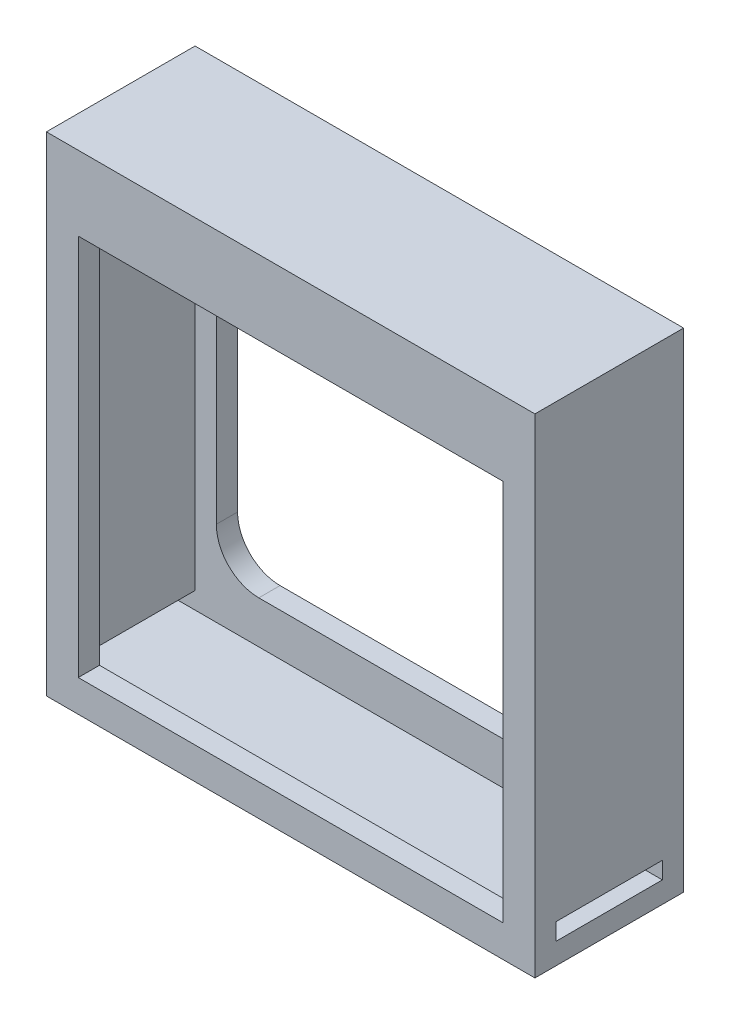
ISO-10303-21;
HEADER;
FILE_DESCRIPTION(('STEP AP214'),'2;1');
FILE_NAME('part.step','',(''),(''),'','','');
FILE_SCHEMA(('AUTOMOTIVE_DESIGN { 1 0 10303 214 1 1 1 1 }'));
ENDSEC;
DATA;
#1=APPLICATION_CONTEXT('core data for automotive mechanical design processes');
#2=APPLICATION_PROTOCOL_DEFINITION('international standard','automotive_design',2000,#1);
#3=PRODUCT_CONTEXT('',#1,'mechanical');
#4=PRODUCT('Part','Part','',(#3));
#5=PRODUCT_RELATED_PRODUCT_CATEGORY('part','',(#4));
#6=PRODUCT_DEFINITION_FORMATION('','',#4);
#7=PRODUCT_DEFINITION_CONTEXT('part definition',#1,'design');
#8=PRODUCT_DEFINITION('design','',#6,#7);
#9=PRODUCT_DEFINITION_SHAPE('','',#8);
#10=(LENGTH_UNIT() NAMED_UNIT(*) SI_UNIT(.MILLI.,.METRE.));
#11=(NAMED_UNIT(*) PLANE_ANGLE_UNIT() SI_UNIT($,.RADIAN.));
#12=(NAMED_UNIT(*) SI_UNIT($,.STERADIAN.) SOLID_ANGLE_UNIT());
#13=UNCERTAINTY_MEASURE_WITH_UNIT(LENGTH_MEASURE(1.E-05),#10,'distance_accuracy_value','');
#14=(GEOMETRIC_REPRESENTATION_CONTEXT(3) GLOBAL_UNCERTAINTY_ASSIGNED_CONTEXT((#13)) GLOBAL_UNIT_ASSIGNED_CONTEXT((#10,
#11,#12)) REPRESENTATION_CONTEXT('',''));
#15=CARTESIAN_POINT('',(0.,0.,0.));
#16=DIRECTION('',(0.,0.,1.));
#17=DIRECTION('',(1.,0.,0.));
#18=AXIS2_PLACEMENT_3D('',#15,#16,#17);
#19=CARTESIAN_POINT('',(57.5,-57.5,35.));
#20=DIRECTION('',(-1.,0.,0.));
#21=DIRECTION('',(0.,0.,1.));
#22=AXIS2_PLACEMENT_3D('',#19,#20,#21);
#23=PLANE('',#22);
#24=DIRECTION('',(0.,0.,1.));
#25=VECTOR('',#24,1.);
#26=CARTESIAN_POINT('',(57.5,-48.5,0.));
#27=LINE('',#26,#25);
#28=CARTESIAN_POINT('',(57.5,-48.5,5.));
#29=VERTEX_POINT('',#28);
#30=CARTESIAN_POINT('',(57.5,-48.5,30.));
#31=VERTEX_POINT('',#30);
#32=EDGE_CURVE('E212',#29,#31,#27,.T.);
#33=ORIENTED_EDGE('',*,*,#32,.F.);
#34=DIRECTION('',(0.,1.,0.));
#35=VECTOR('',#34,1.);
#36=CARTESIAN_POINT('',(57.5,0.,5.));
#37=LINE('',#36,#35);
#38=CARTESIAN_POINT('',(57.5,-52.5,5.));
#39=VERTEX_POINT('',#38);
#40=EDGE_CURVE('E52',#39,#29,#37,.T.);
#41=ORIENTED_EDGE('',*,*,#40,.F.);
#42=DIRECTION('',(0.,0.,-1.));
#43=VECTOR('',#42,1.);
#44=CARTESIAN_POINT('',(57.5,-52.5,0.));
#45=LINE('',#44,#43);
#46=CARTESIAN_POINT('',(57.5,-52.5,30.));
#47=VERTEX_POINT('',#46);
#48=EDGE_CURVE('E219',#47,#39,#45,.T.);
#49=ORIENTED_EDGE('',*,*,#48,.F.);
#50=DIRECTION('',(0.,-1.,0.));
#51=VECTOR('',#50,1.);
#52=CARTESIAN_POINT('',(57.5,0.,30.));
#53=LINE('',#52,#51);
#54=EDGE_CURVE('E202',#31,#47,#53,.T.);
#55=ORIENTED_EDGE('',*,*,#54,.F.);
#56=EDGE_LOOP('',(#33,#41,#49,#55));
#57=FACE_BOUND('',#56,.T.);
#58=DIRECTION('',(0.,1.,0.));
#59=VECTOR('',#58,1.);
#60=CARTESIAN_POINT('',(57.5,-57.5,0.));
#61=LINE('',#60,#59);
#62=CARTESIAN_POINT('',(57.5,-57.5,0.));
#63=VERTEX_POINT('',#62);
#64=CARTESIAN_POINT('',(57.5,57.5,0.));
#65=VERTEX_POINT('',#64);
#66=EDGE_CURVE('E280',#63,#65,#61,.T.);
#67=ORIENTED_EDGE('',*,*,#66,.T.);
#68=DIRECTION('',(0.,0.,-1.));
#69=VECTOR('',#68,1.);
#70=CARTESIAN_POINT('',(57.5,57.5,35.));
#71=LINE('',#70,#69);
#72=CARTESIAN_POINT('',(57.5,57.5,35.));
#73=VERTEX_POINT('',#72);
#74=EDGE_CURVE('E307',#73,#65,#71,.T.);
#75=ORIENTED_EDGE('',*,*,#74,.F.);
#76=DIRECTION('',(0.,1.,0.));
#77=VECTOR('',#76,1.);
#78=CARTESIAN_POINT('',(57.5,-57.5,35.));
#79=LINE('',#78,#77);
#80=CARTESIAN_POINT('',(57.5,-57.5,35.));
#81=VERTEX_POINT('',#80);
#82=EDGE_CURVE('E281',#81,#73,#79,.T.);
#83=ORIENTED_EDGE('',*,*,#82,.F.);
#84=DIRECTION('',(0.,0.,-1.));
#85=VECTOR('',#84,1.);
#86=CARTESIAN_POINT('',(57.5,-57.5,35.));
#87=LINE('',#86,#85);
#88=EDGE_CURVE('E291',#81,#63,#87,.T.);
#89=ORIENTED_EDGE('',*,*,#88,.T.);
#90=EDGE_LOOP('',(#67,#75,#83,#89));
#91=FACE_BOUND('',#90,.T.);
#92=ADVANCED_FACE('F37',(#57,#91),#23,.F.);
#93=CARTESIAN_POINT('',(-57.5,57.5,35.));
#94=DIRECTION('',(0.,-1.,0.));
#95=DIRECTION('',(0.,0.,-1.));
#96=AXIS2_PLACEMENT_3D('',#93,#94,#95);
#97=PLANE('',#96);
#98=DIRECTION('',(-1.,0.,0.));
#99=VECTOR('',#98,1.);
#100=CARTESIAN_POINT('',(-57.5,57.5,0.));
#101=LINE('',#100,#99);
#102=CARTESIAN_POINT('',(-57.5,57.5,0.));
#103=VERTEX_POINT('',#102);
#104=EDGE_CURVE('E294',#65,#103,#101,.T.);
#105=ORIENTED_EDGE('',*,*,#104,.T.);
#106=DIRECTION('',(0.,0.,-1.));
#107=VECTOR('',#106,1.);
#108=CARTESIAN_POINT('',(-57.5,57.5,35.));
#109=LINE('',#108,#107);
#110=CARTESIAN_POINT('',(-57.5,57.5,35.));
#111=VERTEX_POINT('',#110);
#112=EDGE_CURVE('E304',#111,#103,#109,.T.);
#113=ORIENTED_EDGE('',*,*,#112,.F.);
#114=DIRECTION('',(-1.,0.,0.));
#115=VECTOR('',#114,1.);
#116=CARTESIAN_POINT('',(-57.5,57.5,35.));
#117=LINE('',#116,#115);
#118=EDGE_CURVE('E284',#73,#111,#117,.T.);
#119=ORIENTED_EDGE('',*,*,#118,.F.);
#120=ORIENTED_EDGE('',*,*,#74,.T.);
#121=EDGE_LOOP('',(#105,#113,#119,#120));
#122=FACE_BOUND('',#121,.T.);
#123=ADVANCED_FACE('F424',(#122),#97,.F.);
#124=CARTESIAN_POINT('',(-57.5,-57.5,35.));
#125=DIRECTION('',(1.,0.,0.));
#126=DIRECTION('',(0.,0.,-1.));
#127=AXIS2_PLACEMENT_3D('',#124,#125,#126);
#128=PLANE('',#127);
#129=DIRECTION('',(0.,0.,-1.));
#130=VECTOR('',#129,1.);
#131=CARTESIAN_POINT('',(-57.5,-52.5,0.));
#132=LINE('',#131,#130);
#133=CARTESIAN_POINT('',(-57.5,-52.5,30.));
#134=VERTEX_POINT('',#133);
#135=CARTESIAN_POINT('',(-57.5,-52.5,5.));
#136=VERTEX_POINT('',#135);
#137=EDGE_CURVE('E231',#134,#136,#132,.T.);
#138=ORIENTED_EDGE('',*,*,#137,.T.);
#139=DIRECTION('',(0.,1.,0.));
#140=VECTOR('',#139,1.);
#141=CARTESIAN_POINT('',(-57.5,0.,5.));
#142=LINE('',#141,#140);
#143=CARTESIAN_POINT('',(-57.5,-48.5,5.));
#144=VERTEX_POINT('',#143);
#145=EDGE_CURVE('E221',#136,#144,#142,.T.);
#146=ORIENTED_EDGE('',*,*,#145,.T.);
#147=DIRECTION('',(0.,0.,1.));
#148=VECTOR('',#147,1.);
#149=CARTESIAN_POINT('',(-57.5,-48.5,0.));
#150=LINE('',#149,#148);
#151=CARTESIAN_POINT('',(-57.5,-48.5,30.));
#152=VERTEX_POINT('',#151);
#153=EDGE_CURVE('E227',#144,#152,#150,.T.);
#154=ORIENTED_EDGE('',*,*,#153,.T.);
#155=DIRECTION('',(0.,-1.,0.));
#156=VECTOR('',#155,1.);
#157=CARTESIAN_POINT('',(-57.5,0.,30.));
#158=LINE('',#157,#156);
#159=EDGE_CURVE('E60',#152,#134,#158,.T.);
#160=ORIENTED_EDGE('',*,*,#159,.T.);
#161=EDGE_LOOP('',(#138,#146,#154,#160));
#162=FACE_BOUND('',#161,.T.);
#163=DIRECTION('',(0.,-1.,0.));
#164=VECTOR('',#163,1.);
#165=CARTESIAN_POINT('',(-57.5,-57.5,0.));
#166=LINE('',#165,#164);
#167=CARTESIAN_POINT('',(-57.5,-57.5,0.));
#168=VERTEX_POINT('',#167);
#169=EDGE_CURVE('E296',#103,#168,#166,.T.);
#170=ORIENTED_EDGE('',*,*,#169,.T.);
#171=DIRECTION('',(0.,0.,-1.));
#172=VECTOR('',#171,1.);
#173=CARTESIAN_POINT('',(-57.5,-57.5,35.));
#174=LINE('',#173,#172);
#175=CARTESIAN_POINT('',(-57.5,-57.5,35.));
#176=VERTEX_POINT('',#175);
#177=EDGE_CURVE('E301',#176,#168,#174,.T.);
#178=ORIENTED_EDGE('',*,*,#177,.F.);
#179=DIRECTION('',(0.,-1.,0.));
#180=VECTOR('',#179,1.);
#181=CARTESIAN_POINT('',(-57.5,-57.5,35.));
#182=LINE('',#181,#180);
#183=EDGE_CURVE('E287',#111,#176,#182,.T.);
#184=ORIENTED_EDGE('',*,*,#183,.F.);
#185=ORIENTED_EDGE('',*,*,#112,.T.);
#186=EDGE_LOOP('',(#170,#178,#184,#185));
#187=FACE_BOUND('',#186,.T.);
#188=ADVANCED_FACE('F429',(#162,#187),#128,.F.);
#189=CARTESIAN_POINT('',(-57.5,-57.5,35.));
#190=DIRECTION('',(0.,1.,0.));
#191=DIRECTION('',(0.,0.,1.));
#192=AXIS2_PLACEMENT_3D('',#189,#190,#191);
#193=PLANE('',#192);
#194=DIRECTION('',(1.,0.,0.));
#195=VECTOR('',#194,1.);
#196=CARTESIAN_POINT('',(-57.5,-57.5,0.));
#197=LINE('',#196,#195);
#198=EDGE_CURVE('E285',#168,#63,#197,.T.);
#199=ORIENTED_EDGE('',*,*,#198,.T.);
#200=ORIENTED_EDGE('',*,*,#88,.F.);
#201=DIRECTION('',(1.,0.,0.));
#202=VECTOR('',#201,1.);
#203=CARTESIAN_POINT('',(-57.5,-57.5,35.));
#204=LINE('',#203,#202);
#205=EDGE_CURVE('E289',#176,#81,#204,.T.);
#206=ORIENTED_EDGE('',*,*,#205,.F.);
#207=ORIENTED_EDGE('',*,*,#177,.T.);
#208=EDGE_LOOP('',(#199,#200,#206,#207));
#209=FACE_BOUND('',#208,.T.);
#210=ADVANCED_FACE('F487',(#209),#193,.F.);
#211=CARTESIAN_POINT('',(0.,0.,35.));
#212=DIRECTION('',(0.,0.,-1.));
#213=DIRECTION('',(-1.,0.,0.));
#214=AXIS2_PLACEMENT_3D('',#211,#212,#213);
#215=PLANE('',#214);
#216=DIRECTION('',(0.,1.,0.));
#217=VECTOR('',#216,1.);
#218=CARTESIAN_POINT('',(50.,0.,35.));
#219=LINE('',#218,#217);
#220=CARTESIAN_POINT('',(50.,-50.,35.));
#221=VERTEX_POINT('',#220);
#222=CARTESIAN_POINT('',(50.,40.,35.));
#223=VERTEX_POINT('',#222);
#224=EDGE_CURVE('E253',#221,#223,#219,.T.);
#225=ORIENTED_EDGE('',*,*,#224,.F.);
#226=DIRECTION('',(1.,0.,0.));
#227=VECTOR('',#226,1.);
#228=CARTESIAN_POINT('',(0.,-50.,35.));
#229=LINE('',#228,#227);
#230=CARTESIAN_POINT('',(-50.,-50.,35.));
#231=VERTEX_POINT('',#230);
#232=EDGE_CURVE('E251',#231,#221,#229,.T.);
#233=ORIENTED_EDGE('',*,*,#232,.F.);
#234=DIRECTION('',(0.,1.,0.));
#235=VECTOR('',#234,1.);
#236=CARTESIAN_POINT('',(-50.,0.,35.));
#237=LINE('',#236,#235);
#238=CARTESIAN_POINT('',(-50.,40.,35.));
#239=VERTEX_POINT('',#238);
#240=EDGE_CURVE('E259',#231,#239,#237,.T.);
#241=ORIENTED_EDGE('',*,*,#240,.T.);
#242=DIRECTION('',(1.,0.,0.));
#243=VECTOR('',#242,1.);
#244=CARTESIAN_POINT('',(0.,40.,35.));
#245=LINE('',#244,#243);
#246=EDGE_CURVE('E256',#239,#223,#245,.T.);
#247=ORIENTED_EDGE('',*,*,#246,.T.);
#248=EDGE_LOOP('',(#225,#233,#241,#247));
#249=FACE_BOUND('',#248,.T.);
#250=ORIENTED_EDGE('',*,*,#82,.T.);
#251=ORIENTED_EDGE('',*,*,#118,.T.);
#252=ORIENTED_EDGE('',*,*,#183,.T.);
#253=ORIENTED_EDGE('',*,*,#205,.T.);
#254=EDGE_LOOP('',(#250,#251,#252,#253));
#255=FACE_BOUND('',#254,.T.);
#256=ADVANCED_FACE('F484',(#249,#255),#215,.F.);
#257=CARTESIAN_POINT('',(0.,0.,0.));
#258=DIRECTION('',(0.,0.,-1.));
#259=DIRECTION('',(-1.,0.,0.));
#260=AXIS2_PLACEMENT_3D('',#257,#258,#259);
#261=PLANE('',#260);
#262=DIRECTION('',(-1.,0.,0.));
#263=VECTOR('',#262,1.);
#264=CARTESIAN_POINT('',(0.,-42.5,0.));
#265=LINE('',#264,#263);
#266=CARTESIAN_POINT('',(37.5,-42.5,0.));
#267=VERTEX_POINT('',#266);
#268=CARTESIAN_POINT('',(-37.5,-42.5,0.));
#269=VERTEX_POINT('',#268);
#270=EDGE_CURVE('E239',#267,#269,#265,.T.);
#271=ORIENTED_EDGE('',*,*,#270,.F.);
#272=CARTESIAN_POINT('',(37.5,-32.5,0.));
#273=DIRECTION('',(0.,0.,-1.));
#274=DIRECTION('',(-1.,0.,0.));
#275=AXIS2_PLACEMENT_3D('',#272,#273,#274);
#276=CIRCLE('',#275,10.);
#277=CARTESIAN_POINT('',(47.5,-32.5,0.));
#278=VERTEX_POINT('',#277);
#279=EDGE_CURVE('E369',#267,#278,#276,.F.);
#280=ORIENTED_EDGE('',*,*,#279,.T.);
#281=DIRECTION('',(0.,1.,0.));
#282=VECTOR('',#281,1.);
#283=CARTESIAN_POINT('',(47.5,0.,0.));
#284=LINE('',#283,#282);
#285=CARTESIAN_POINT('',(47.5,37.5,0.));
#286=VERTEX_POINT('',#285);
#287=EDGE_CURVE('E248',#278,#286,#284,.T.);
#288=ORIENTED_EDGE('',*,*,#287,.T.);
#289=CARTESIAN_POINT('',(37.5,37.5,0.));
#290=DIRECTION('',(0.,0.,-1.));
#291=DIRECTION('',(-1.,0.,0.));
#292=AXIS2_PLACEMENT_3D('',#289,#290,#291);
#293=CIRCLE('',#292,10.);
#294=CARTESIAN_POINT('',(37.5,47.5,0.));
#295=VERTEX_POINT('',#294);
#296=EDGE_CURVE('E45',#286,#295,#293,.F.);
#297=ORIENTED_EDGE('',*,*,#296,.T.);
#298=DIRECTION('',(-1.,0.,0.));
#299=VECTOR('',#298,1.);
#300=CARTESIAN_POINT('',(0.,47.5,0.));
#301=LINE('',#300,#299);
#302=CARTESIAN_POINT('',(-37.5,47.5,0.));
#303=VERTEX_POINT('',#302);
#304=EDGE_CURVE('E245',#295,#303,#301,.T.);
#305=ORIENTED_EDGE('',*,*,#304,.T.);
#306=CARTESIAN_POINT('',(-37.5,37.5,0.));
#307=DIRECTION('',(0.,0.,-1.));
#308=DIRECTION('',(-1.,0.,0.));
#309=AXIS2_PLACEMENT_3D('',#306,#307,#308);
#310=CIRCLE('',#309,10.);
#311=CARTESIAN_POINT('',(-47.5,37.5,0.));
#312=VERTEX_POINT('',#311);
#313=EDGE_CURVE('E373',#303,#312,#310,.F.);
#314=ORIENTED_EDGE('',*,*,#313,.T.);
#315=DIRECTION('',(0.,1.,0.));
#316=VECTOR('',#315,1.);
#317=CARTESIAN_POINT('',(-47.5,0.,0.));
#318=LINE('',#317,#316);
#319=CARTESIAN_POINT('',(-47.5,-32.5,0.));
#320=VERTEX_POINT('',#319);
#321=EDGE_CURVE('E242',#320,#312,#318,.T.);
#322=ORIENTED_EDGE('',*,*,#321,.F.);
#323=CARTESIAN_POINT('',(-37.5,-32.5,0.));
#324=DIRECTION('',(0.,0.,-1.));
#325=DIRECTION('',(-1.,0.,0.));
#326=AXIS2_PLACEMENT_3D('',#323,#324,#325);
#327=CIRCLE('',#326,10.);
#328=EDGE_CURVE('E365',#320,#269,#327,.F.);
#329=ORIENTED_EDGE('',*,*,#328,.T.);
#330=EDGE_LOOP('',(#271,#280,#288,#297,#305,#314,#322,#329));
#331=FACE_BOUND('',#330,.T.);
#332=ORIENTED_EDGE('',*,*,#66,.F.);
#333=ORIENTED_EDGE('',*,*,#198,.F.);
#334=ORIENTED_EDGE('',*,*,#169,.F.);
#335=ORIENTED_EDGE('',*,*,#104,.F.);
#336=EDGE_LOOP('',(#332,#333,#334,#335));
#337=FACE_BOUND('',#336,.T.);
#338=ADVANCED_FACE('F379',(#331,#337),#261,.T.);
#339=CARTESIAN_POINT('',(0.,-50.,5.));
#340=DIRECTION('',(0.,-1.,0.));
#341=DIRECTION('',(0.,0.,-1.));
#342=AXIS2_PLACEMENT_3D('',#339,#340,#341);
#343=PLANE('',#342);
#344=DIRECTION('',(-1.,0.,0.));
#345=VECTOR('',#344,1.);
#346=CARTESIAN_POINT('',(0.,-50.,30.));
#347=LINE('',#346,#345);
#348=CARTESIAN_POINT('',(50.,-50.,30.));
#349=VERTEX_POINT('',#348);
#350=CARTESIAN_POINT('',(-50.,-50.,30.));
#351=VERTEX_POINT('',#350);
#352=EDGE_CURVE('E277',#349,#351,#347,.T.);
#353=ORIENTED_EDGE('',*,*,#352,.T.);
#354=DIRECTION('',(0.,0.,1.));
#355=VECTOR('',#354,1.);
#356=CARTESIAN_POINT('',(-50.,-50.,5.));
#357=LINE('',#356,#355);
#358=EDGE_CURVE('E263',#351,#231,#357,.T.);
#359=ORIENTED_EDGE('',*,*,#358,.T.);
#360=ORIENTED_EDGE('',*,*,#232,.T.);
#361=DIRECTION('',(0.,0.,1.));
#362=VECTOR('',#361,1.);
#363=CARTESIAN_POINT('',(50.,-50.,5.));
#364=LINE('',#363,#362);
#365=EDGE_CURVE('E262',#349,#221,#364,.T.);
#366=ORIENTED_EDGE('',*,*,#365,.F.);
#367=EDGE_LOOP('',(#353,#359,#360,#366));
#368=FACE_BOUND('',#367,.T.);
#369=ADVANCED_FACE('F473',(#368),#343,.F.);
#370=CARTESIAN_POINT('',(-50.,0.,5.));
#371=DIRECTION('',(1.,0.,0.));
#372=DIRECTION('',(0.,0.,-1.));
#373=AXIS2_PLACEMENT_3D('',#370,#371,#372);
#374=PLANE('',#373);
#375=DIRECTION('',(0.,0.,1.));
#376=VECTOR('',#375,1.);
#377=CARTESIAN_POINT('',(-50.,40.,5.));
#378=LINE('',#377,#376);
#379=CARTESIAN_POINT('',(-50.,40.,30.));
#380=VERTEX_POINT('',#379);
#381=EDGE_CURVE('E266',#380,#239,#378,.T.);
#382=ORIENTED_EDGE('',*,*,#381,.T.);
#383=ORIENTED_EDGE('',*,*,#240,.F.);
#384=ORIENTED_EDGE('',*,*,#358,.F.);
#385=DIRECTION('',(0.,-1.,0.));
#386=VECTOR('',#385,1.);
#387=CARTESIAN_POINT('',(-50.,0.,30.));
#388=LINE('',#387,#386);
#389=EDGE_CURVE('E275',#380,#351,#388,.T.);
#390=ORIENTED_EDGE('',*,*,#389,.F.);
#391=EDGE_LOOP('',(#382,#383,#384,#390));
#392=FACE_BOUND('',#391,.T.);
#393=ADVANCED_FACE('F469',(#392),#374,.T.);
#394=CARTESIAN_POINT('',(0.,40.,5.));
#395=DIRECTION('',(0.,-1.,0.));
#396=DIRECTION('',(0.,0.,-1.));
#397=AXIS2_PLACEMENT_3D('',#394,#395,#396);
#398=PLANE('',#397);
#399=DIRECTION('',(0.,0.,1.));
#400=VECTOR('',#399,1.);
#401=CARTESIAN_POINT('',(50.,40.,5.));
#402=LINE('',#401,#400);
#403=CARTESIAN_POINT('',(50.,40.,30.));
#404=VERTEX_POINT('',#403);
#405=EDGE_CURVE('E268',#404,#223,#402,.T.);
#406=ORIENTED_EDGE('',*,*,#405,.T.);
#407=ORIENTED_EDGE('',*,*,#246,.F.);
#408=ORIENTED_EDGE('',*,*,#381,.F.);
#409=DIRECTION('',(-1.,0.,0.));
#410=VECTOR('',#409,1.);
#411=CARTESIAN_POINT('',(0.,40.,30.));
#412=LINE('',#411,#410);
#413=EDGE_CURVE('E273',#404,#380,#412,.T.);
#414=ORIENTED_EDGE('',*,*,#413,.F.);
#415=EDGE_LOOP('',(#406,#407,#408,#414));
#416=FACE_BOUND('',#415,.T.);
#417=ADVANCED_FACE('F472',(#416),#398,.T.);
#418=CARTESIAN_POINT('',(50.,0.,5.));
#419=DIRECTION('',(1.,0.,0.));
#420=DIRECTION('',(0.,0.,-1.));
#421=AXIS2_PLACEMENT_3D('',#418,#419,#420);
#422=PLANE('',#421);
#423=DIRECTION('',(0.,-1.,0.));
#424=VECTOR('',#423,1.);
#425=CARTESIAN_POINT('',(50.,0.,30.));
#426=LINE('',#425,#424);
#427=EDGE_CURVE('E265',#404,#349,#426,.T.);
#428=ORIENTED_EDGE('',*,*,#427,.T.);
#429=ORIENTED_EDGE('',*,*,#365,.T.);
#430=ORIENTED_EDGE('',*,*,#224,.T.);
#431=ORIENTED_EDGE('',*,*,#405,.F.);
#432=EDGE_LOOP('',(#428,#429,#430,#431));
#433=FACE_BOUND('',#432,.T.);
#434=ADVANCED_FACE('F438',(#433),#422,.F.);
#435=CARTESIAN_POINT('',(52.5,-57.5,35.));
#436=DIRECTION('',(-1.,0.,0.));
#437=DIRECTION('',(0.,0.,1.));
#438=AXIS2_PLACEMENT_3D('',#435,#436,#437);
#439=PLANE('',#438);
#440=DIRECTION('',(0.,0.,-1.));
#441=VECTOR('',#440,1.);
#442=CARTESIAN_POINT('',(52.5,-48.5,35.));
#443=LINE('',#442,#441);
#444=CARTESIAN_POINT('',(52.5,-48.5,30.));
#445=VERTEX_POINT('',#444);
#446=CARTESIAN_POINT('',(52.5,-48.5,5.));
#447=VERTEX_POINT('',#446);
#448=EDGE_CURVE('E237',#445,#447,#443,.T.);
#449=ORIENTED_EDGE('',*,*,#448,.F.);
#450=DIRECTION('',(0.,1.,0.));
#451=VECTOR('',#450,1.);
#452=CARTESIAN_POINT('',(52.5,0.,30.));
#453=LINE('',#452,#451);
#454=CARTESIAN_POINT('',(52.5,52.5,30.));
#455=VERTEX_POINT('',#454);
#456=EDGE_CURVE('E205',#445,#455,#453,.T.);
#457=ORIENTED_EDGE('',*,*,#456,.T.);
#458=DIRECTION('',(0.,0.,-1.));
#459=VECTOR('',#458,1.);
#460=CARTESIAN_POINT('',(52.5,52.5,35.));
#461=LINE('',#460,#459);
#462=CARTESIAN_POINT('',(52.5,52.5,5.));
#463=VERTEX_POINT('',#462);
#464=EDGE_CURVE('E328',#455,#463,#461,.T.);
#465=ORIENTED_EDGE('',*,*,#464,.T.);
#466=DIRECTION('',(0.,1.,0.));
#467=VECTOR('',#466,1.);
#468=CARTESIAN_POINT('',(52.5,0.,5.));
#469=LINE('',#468,#467);
#470=EDGE_CURVE('E310',#447,#463,#469,.T.);
#471=ORIENTED_EDGE('',*,*,#470,.F.);
#472=EDGE_LOOP('',(#449,#457,#465,#471));
#473=FACE_BOUND('',#472,.T.);
#474=ADVANCED_FACE('F434',(#473),#439,.T.);
#475=CARTESIAN_POINT('',(-57.5,52.5,35.));
#476=DIRECTION('',(0.,-1.,0.));
#477=DIRECTION('',(0.,0.,-1.));
#478=AXIS2_PLACEMENT_3D('',#475,#476,#477);
#479=PLANE('',#478);
#480=DIRECTION('',(-1.,0.,0.));
#481=VECTOR('',#480,1.);
#482=CARTESIAN_POINT('',(0.,52.5,5.));
#483=LINE('',#482,#481);
#484=CARTESIAN_POINT('',(-52.5,52.5,5.));
#485=VERTEX_POINT('',#484);
#486=EDGE_CURVE('E331',#463,#485,#483,.T.);
#487=ORIENTED_EDGE('',*,*,#486,.F.);
#488=ORIENTED_EDGE('',*,*,#464,.F.);
#489=DIRECTION('',(-1.,0.,0.));
#490=VECTOR('',#489,1.);
#491=CARTESIAN_POINT('',(0.,52.5,30.));
#492=LINE('',#491,#490);
#493=CARTESIAN_POINT('',(-52.5,52.5,30.));
#494=VERTEX_POINT('',#493);
#495=EDGE_CURVE('E317',#455,#494,#492,.T.);
#496=ORIENTED_EDGE('',*,*,#495,.T.);
#497=DIRECTION('',(0.,0.,-1.));
#498=VECTOR('',#497,1.);
#499=CARTESIAN_POINT('',(-52.5,52.5,35.));
#500=LINE('',#499,#498);
#501=EDGE_CURVE('E322',#494,#485,#500,.T.);
#502=ORIENTED_EDGE('',*,*,#501,.T.);
#503=EDGE_LOOP('',(#487,#488,#496,#502));
#504=FACE_BOUND('',#503,.T.);
#505=ADVANCED_FACE('F437',(#504),#479,.T.);
#506=CARTESIAN_POINT('',(-52.5,-57.5,35.));
#507=DIRECTION('',(1.,0.,0.));
#508=DIRECTION('',(0.,0.,-1.));
#509=AXIS2_PLACEMENT_3D('',#506,#507,#508);
#510=PLANE('',#509);
#511=DIRECTION('',(0.,0.,1.));
#512=VECTOR('',#511,1.);
#513=CARTESIAN_POINT('',(-52.5,-48.5,35.));
#514=LINE('',#513,#512);
#515=CARTESIAN_POINT('',(-52.5,-48.5,5.));
#516=VERTEX_POINT('',#515);
#517=CARTESIAN_POINT('',(-52.5,-48.5,30.));
#518=VERTEX_POINT('',#517);
#519=EDGE_CURVE('E234',#516,#518,#514,.T.);
#520=ORIENTED_EDGE('',*,*,#519,.F.);
#521=DIRECTION('',(0.,-1.,0.));
#522=VECTOR('',#521,1.);
#523=CARTESIAN_POINT('',(-52.5,0.,5.));
#524=LINE('',#523,#522);
#525=EDGE_CURVE('E325',#485,#516,#524,.T.);
#526=ORIENTED_EDGE('',*,*,#525,.F.);
#527=ORIENTED_EDGE('',*,*,#501,.F.);
#528=DIRECTION('',(0.,-1.,0.));
#529=VECTOR('',#528,1.);
#530=CARTESIAN_POINT('',(-52.5,0.,30.));
#531=LINE('',#530,#529);
#532=EDGE_CURVE('E314',#494,#518,#531,.T.);
#533=ORIENTED_EDGE('',*,*,#532,.T.);
#534=EDGE_LOOP('',(#520,#526,#527,#533));
#535=FACE_BOUND('',#534,.T.);
#536=ADVANCED_FACE('F442',(#535),#510,.T.);
#537=CARTESIAN_POINT('',(-57.5,-52.5,35.));
#538=DIRECTION('',(0.,1.,0.));
#539=DIRECTION('',(0.,0.,1.));
#540=AXIS2_PLACEMENT_3D('',#537,#538,#539);
#541=PLANE('',#540);
#542=DIRECTION('',(1.,0.,0.));
#543=VECTOR('',#542,1.);
#544=CARTESIAN_POINT('',(0.,-52.5,5.));
#545=LINE('',#544,#543);
#546=EDGE_CURVE('E320',#136,#39,#545,.T.);
#547=ORIENTED_EDGE('',*,*,#546,.F.);
#548=ORIENTED_EDGE('',*,*,#137,.F.);
#549=DIRECTION('',(1.,0.,0.));
#550=VECTOR('',#549,1.);
#551=CARTESIAN_POINT('',(0.,-52.5,30.));
#552=LINE('',#551,#550);
#553=EDGE_CURVE('E311',#134,#47,#552,.T.);
#554=ORIENTED_EDGE('',*,*,#553,.T.);
#555=ORIENTED_EDGE('',*,*,#48,.T.);
#556=EDGE_LOOP('',(#547,#548,#554,#555));
#557=FACE_BOUND('',#556,.T.);
#558=ADVANCED_FACE('F446',(#557),#541,.T.);
#559=CARTESIAN_POINT('',(0.,0.,30.));
#560=DIRECTION('',(0.,0.,-1.));
#561=DIRECTION('',(-1.,0.,0.));
#562=AXIS2_PLACEMENT_3D('',#559,#560,#561);
#563=PLANE('',#562);
#564=ORIENTED_EDGE('',*,*,#389,.T.);
#565=ORIENTED_EDGE('',*,*,#352,.F.);
#566=ORIENTED_EDGE('',*,*,#427,.F.);
#567=ORIENTED_EDGE('',*,*,#413,.T.);
#568=EDGE_LOOP('',(#564,#565,#566,#567));
#569=FACE_BOUND('',#568,.T.);
#570=ORIENTED_EDGE('',*,*,#553,.F.);
#571=ORIENTED_EDGE('',*,*,#159,.F.);
#572=DIRECTION('',(1.,0.,0.));
#573=VECTOR('',#572,1.);
#574=CARTESIAN_POINT('',(-57.5,-48.5,30.));
#575=LINE('',#574,#573);
#576=EDGE_CURVE('E208',#152,#518,#575,.T.);
#577=ORIENTED_EDGE('',*,*,#576,.T.);
#578=ORIENTED_EDGE('',*,*,#532,.F.);
#579=ORIENTED_EDGE('',*,*,#495,.F.);
#580=ORIENTED_EDGE('',*,*,#456,.F.);
#581=EDGE_CURVE('E198',#445,#31,#575,.T.);
#582=ORIENTED_EDGE('',*,*,#581,.T.);
#583=ORIENTED_EDGE('',*,*,#54,.T.);
#584=EDGE_LOOP('',(#570,#571,#577,#578,#579,#580,#582,#583));
#585=FACE_BOUND('',#584,.T.);
#586=ADVANCED_FACE('F200',(#569,#585),#563,.T.);
#587=CARTESIAN_POINT('',(0.,0.,5.));
#588=DIRECTION('',(0.,0.,-1.));
#589=DIRECTION('',(-1.,0.,0.));
#590=AXIS2_PLACEMENT_3D('',#587,#588,#589);
#591=PLANE('',#590);
#592=DIRECTION('',(0.,1.,0.));
#593=VECTOR('',#592,1.);
#594=CARTESIAN_POINT('',(47.5,0.,5.));
#595=LINE('',#594,#593);
#596=CARTESIAN_POINT('',(47.5,-32.5,5.));
#597=VERTEX_POINT('',#596);
#598=CARTESIAN_POINT('',(47.5,37.5,5.));
#599=VERTEX_POINT('',#598);
#600=EDGE_CURVE('E339',#597,#599,#595,.T.);
#601=ORIENTED_EDGE('',*,*,#600,.F.);
#602=CARTESIAN_POINT('',(37.5,-32.5,5.));
#603=DIRECTION('',(0.,0.,-1.));
#604=DIRECTION('',(-1.,0.,0.));
#605=AXIS2_PLACEMENT_3D('',#602,#603,#604);
#606=CIRCLE('',#605,10.);
#607=CARTESIAN_POINT('',(37.5,-42.5,5.));
#608=VERTEX_POINT('',#607);
#609=EDGE_CURVE('E371',#597,#608,#606,.T.);
#610=ORIENTED_EDGE('',*,*,#609,.T.);
#611=DIRECTION('',(-1.,0.,0.));
#612=VECTOR('',#611,1.);
#613=CARTESIAN_POINT('',(0.,-42.5,5.));
#614=LINE('',#613,#612);
#615=CARTESIAN_POINT('',(-37.5,-42.5,5.));
#616=VERTEX_POINT('',#615);
#617=EDGE_CURVE('E342',#608,#616,#614,.T.);
#618=ORIENTED_EDGE('',*,*,#617,.T.);
#619=CARTESIAN_POINT('',(-37.5,-32.5,5.));
#620=DIRECTION('',(0.,0.,-1.));
#621=DIRECTION('',(-1.,0.,0.));
#622=AXIS2_PLACEMENT_3D('',#619,#620,#621);
#623=CIRCLE('',#622,10.);
#624=CARTESIAN_POINT('',(-47.5,-32.5,5.));
#625=VERTEX_POINT('',#624);
#626=EDGE_CURVE('E367',#616,#625,#623,.T.);
#627=ORIENTED_EDGE('',*,*,#626,.T.);
#628=DIRECTION('',(0.,1.,0.));
#629=VECTOR('',#628,1.);
#630=CARTESIAN_POINT('',(-47.5,0.,5.));
#631=LINE('',#630,#629);
#632=CARTESIAN_POINT('',(-47.5,37.5,5.));
#633=VERTEX_POINT('',#632);
#634=EDGE_CURVE('E313',#625,#633,#631,.T.);
#635=ORIENTED_EDGE('',*,*,#634,.T.);
#636=CARTESIAN_POINT('',(-37.5,37.5,5.));
#637=DIRECTION('',(0.,0.,-1.));
#638=DIRECTION('',(-1.,0.,0.));
#639=AXIS2_PLACEMENT_3D('',#636,#637,#638);
#640=CIRCLE('',#639,10.);
#641=CARTESIAN_POINT('',(-37.5,47.5,5.));
#642=VERTEX_POINT('',#641);
#643=EDGE_CURVE('E375',#633,#642,#640,.T.);
#644=ORIENTED_EDGE('',*,*,#643,.T.);
#645=DIRECTION('',(-1.,0.,0.));
#646=VECTOR('',#645,1.);
#647=CARTESIAN_POINT('',(0.,47.5,5.));
#648=LINE('',#647,#646);
#649=CARTESIAN_POINT('',(37.5,47.5,5.));
#650=VERTEX_POINT('',#649);
#651=EDGE_CURVE('E336',#650,#642,#648,.T.);
#652=ORIENTED_EDGE('',*,*,#651,.F.);
#653=CARTESIAN_POINT('',(37.5,37.5,5.));
#654=DIRECTION('',(0.,0.,-1.));
#655=DIRECTION('',(-1.,0.,0.));
#656=AXIS2_PLACEMENT_3D('',#653,#654,#655);
#657=CIRCLE('',#656,10.);
#658=EDGE_CURVE('E11',#650,#599,#657,.T.);
#659=ORIENTED_EDGE('',*,*,#658,.T.);
#660=EDGE_LOOP('',(#601,#610,#618,#627,#635,#644,#652,#659));
#661=FACE_BOUND('',#660,.T.);
#662=ORIENTED_EDGE('',*,*,#525,.T.);
#663=DIRECTION('',(1.,0.,0.));
#664=VECTOR('',#663,1.);
#665=CARTESIAN_POINT('',(-57.5,-48.5,5.));
#666=LINE('',#665,#664);
#667=EDGE_CURVE('E209',#144,#516,#666,.T.);
#668=ORIENTED_EDGE('',*,*,#667,.F.);
#669=ORIENTED_EDGE('',*,*,#145,.F.);
#670=ORIENTED_EDGE('',*,*,#546,.T.);
#671=ORIENTED_EDGE('',*,*,#40,.T.);
#672=EDGE_CURVE('E214',#447,#29,#666,.T.);
#673=ORIENTED_EDGE('',*,*,#672,.F.);
#674=ORIENTED_EDGE('',*,*,#470,.T.);
#675=ORIENTED_EDGE('',*,*,#486,.T.);
#676=EDGE_LOOP('',(#662,#668,#669,#670,#671,#673,#674,#675));
#677=FACE_BOUND('',#676,.T.);
#678=ADVANCED_FACE('F392',(#661,#677),#591,.F.);
#679=CARTESIAN_POINT('',(0.,-42.5,30.));
#680=DIRECTION('',(0.,-1.,0.));
#681=DIRECTION('',(0.,0.,-1.));
#682=AXIS2_PLACEMENT_3D('',#679,#680,#681);
#683=PLANE('',#682);
#684=ORIENTED_EDGE('',*,*,#270,.T.);
#685=DIRECTION('',(0.,0.,-1.));
#686=VECTOR('',#685,1.);
#687=CARTESIAN_POINT('',(-37.5,-42.5,5.));
#688=LINE('',#687,#686);
#689=EDGE_CURVE('E353',#269,#616,#688,.F.);
#690=ORIENTED_EDGE('',*,*,#689,.T.);
#691=ORIENTED_EDGE('',*,*,#617,.F.);
#692=DIRECTION('',(0.,0.,-1.));
#693=VECTOR('',#692,1.);
#694=CARTESIAN_POINT('',(37.5,-42.5,30.));
#695=LINE('',#694,#693);
#696=EDGE_CURVE('E350',#608,#267,#695,.T.);
#697=ORIENTED_EDGE('',*,*,#696,.T.);
#698=EDGE_LOOP('',(#684,#690,#691,#697));
#699=FACE_BOUND('',#698,.T.);
#700=ADVANCED_FACE('F403',(#699),#683,.F.);
#701=CARTESIAN_POINT('',(47.5,0.,30.));
#702=DIRECTION('',(-1.,0.,0.));
#703=DIRECTION('',(0.,0.,1.));
#704=AXIS2_PLACEMENT_3D('',#701,#702,#703);
#705=PLANE('',#704);
#706=ORIENTED_EDGE('',*,*,#287,.F.);
#707=DIRECTION('',(0.,0.,-1.));
#708=VECTOR('',#707,1.);
#709=CARTESIAN_POINT('',(47.5,-32.5,30.));
#710=LINE('',#709,#708);
#711=EDGE_CURVE('E358',#278,#597,#710,.F.);
#712=ORIENTED_EDGE('',*,*,#711,.T.);
#713=ORIENTED_EDGE('',*,*,#600,.T.);
#714=DIRECTION('',(0.,0.,-1.));
#715=VECTOR('',#714,1.);
#716=CARTESIAN_POINT('',(47.5,37.5,0.));
#717=LINE('',#716,#715);
#718=EDGE_CURVE('E355',#599,#286,#717,.T.);
#719=ORIENTED_EDGE('',*,*,#718,.T.);
#720=EDGE_LOOP('',(#706,#712,#713,#719));
#721=FACE_BOUND('',#720,.T.);
#722=ADVANCED_FACE('F395',(#721),#705,.T.);
#723=CARTESIAN_POINT('',(0.,47.5,30.));
#724=DIRECTION('',(0.,-1.,0.));
#725=DIRECTION('',(0.,0.,-1.));
#726=AXIS2_PLACEMENT_3D('',#723,#724,#725);
#727=PLANE('',#726);
#728=ORIENTED_EDGE('',*,*,#651,.T.);
#729=DIRECTION('',(0.,0.,-1.));
#730=VECTOR('',#729,1.);
#731=CARTESIAN_POINT('',(-37.5,47.5,30.));
#732=LINE('',#731,#730);
#733=EDGE_CURVE('E362',#642,#303,#732,.T.);
#734=ORIENTED_EDGE('',*,*,#733,.T.);
#735=ORIENTED_EDGE('',*,*,#304,.F.);
#736=DIRECTION('',(0.,0.,-1.));
#737=VECTOR('',#736,1.);
#738=CARTESIAN_POINT('',(37.5,47.5,5.));
#739=LINE('',#738,#737);
#740=EDGE_CURVE('E360',#295,#650,#739,.F.);
#741=ORIENTED_EDGE('',*,*,#740,.T.);
#742=EDGE_LOOP('',(#728,#734,#735,#741));
#743=FACE_BOUND('',#742,.T.);
#744=ADVANCED_FACE('F386',(#743),#727,.T.);
#745=CARTESIAN_POINT('',(-47.5,0.,30.));
#746=DIRECTION('',(-1.,0.,0.));
#747=DIRECTION('',(0.,0.,1.));
#748=AXIS2_PLACEMENT_3D('',#745,#746,#747);
#749=PLANE('',#748);
#750=ORIENTED_EDGE('',*,*,#634,.F.);
#751=DIRECTION('',(0.,0.,-1.));
#752=VECTOR('',#751,1.);
#753=CARTESIAN_POINT('',(-47.5,-32.5,0.));
#754=LINE('',#753,#752);
#755=EDGE_CURVE('E347',#625,#320,#754,.T.);
#756=ORIENTED_EDGE('',*,*,#755,.T.);
#757=ORIENTED_EDGE('',*,*,#321,.T.);
#758=DIRECTION('',(0.,0.,-1.));
#759=VECTOR('',#758,1.);
#760=CARTESIAN_POINT('',(-47.5,37.5,30.));
#761=LINE('',#760,#759);
#762=EDGE_CURVE('E345',#312,#633,#761,.F.);
#763=ORIENTED_EDGE('',*,*,#762,.T.);
#764=EDGE_LOOP('',(#750,#756,#757,#763));
#765=FACE_BOUND('',#764,.T.);
#766=ADVANCED_FACE('F411',(#765),#749,.F.);
#767=CARTESIAN_POINT('',(-37.5,-32.5,30.));
#768=DIRECTION('',(0.,0.,1.));
#769=DIRECTION('',(1.,0.,0.));
#770=AXIS2_PLACEMENT_3D('',#767,#768,#769);
#771=CYLINDRICAL_SURFACE('',#770,10.);
#772=ORIENTED_EDGE('',*,*,#626,.F.);
#773=ORIENTED_EDGE('',*,*,#689,.F.);
#774=ORIENTED_EDGE('',*,*,#328,.F.);
#775=ORIENTED_EDGE('',*,*,#755,.F.);
#776=EDGE_LOOP('',(#772,#773,#774,#775));
#777=FACE_BOUND('',#776,.T.);
#778=ADVANCED_FACE('F406',(#777),#771,.F.);
#779=CARTESIAN_POINT('',(37.5,-32.5,30.));
#780=DIRECTION('',(0.,0.,-1.));
#781=DIRECTION('',(-1.,0.,0.));
#782=AXIS2_PLACEMENT_3D('',#779,#780,#781);
#783=CYLINDRICAL_SURFACE('',#782,10.);
#784=ORIENTED_EDGE('',*,*,#609,.F.);
#785=ORIENTED_EDGE('',*,*,#711,.F.);
#786=ORIENTED_EDGE('',*,*,#279,.F.);
#787=ORIENTED_EDGE('',*,*,#696,.F.);
#788=EDGE_LOOP('',(#784,#785,#786,#787));
#789=FACE_BOUND('',#788,.T.);
#790=ADVANCED_FACE('F398',(#789),#783,.F.);
#791=CARTESIAN_POINT('',(-37.5,37.5,30.));
#792=DIRECTION('',(0.,0.,-1.));
#793=DIRECTION('',(-1.,0.,0.));
#794=AXIS2_PLACEMENT_3D('',#791,#792,#793);
#795=CYLINDRICAL_SURFACE('',#794,10.);
#796=ORIENTED_EDGE('',*,*,#643,.F.);
#797=ORIENTED_EDGE('',*,*,#762,.F.);
#798=ORIENTED_EDGE('',*,*,#313,.F.);
#799=ORIENTED_EDGE('',*,*,#733,.F.);
#800=EDGE_LOOP('',(#796,#797,#798,#799));
#801=FACE_BOUND('',#800,.T.);
#802=ADVANCED_FACE('F415',(#801),#795,.F.);
#803=CARTESIAN_POINT('',(37.5,37.5,30.));
#804=DIRECTION('',(0.,0.,1.));
#805=DIRECTION('',(1.,0.,0.));
#806=AXIS2_PLACEMENT_3D('',#803,#804,#805);
#807=CYLINDRICAL_SURFACE('',#806,10.);
#808=ORIENTED_EDGE('',*,*,#658,.F.);
#809=ORIENTED_EDGE('',*,*,#740,.F.);
#810=ORIENTED_EDGE('',*,*,#296,.F.);
#811=ORIENTED_EDGE('',*,*,#718,.F.);
#812=EDGE_LOOP('',(#808,#809,#810,#811));
#813=FACE_BOUND('',#812,.T.);
#814=ADVANCED_FACE('F39',(#813),#807,.F.);
#815=CARTESIAN_POINT('',(-57.5,-48.5,0.));
#816=DIRECTION('',(0.,1.,0.));
#817=DIRECTION('',(0.,0.,1.));
#818=AXIS2_PLACEMENT_3D('',#815,#816,#817);
#819=PLANE('',#818);
#820=ORIENTED_EDGE('',*,*,#519,.T.);
#821=ORIENTED_EDGE('',*,*,#576,.F.);
#822=ORIENTED_EDGE('',*,*,#153,.F.);
#823=ORIENTED_EDGE('',*,*,#667,.T.);
#824=EDGE_LOOP('',(#820,#821,#822,#823));
#825=FACE_BOUND('',#824,.T.);
#826=ADVANCED_FACE('F421',(#825),#819,.F.);
#827=ORIENTED_EDGE('',*,*,#448,.T.);
#828=ORIENTED_EDGE('',*,*,#672,.T.);
#829=ORIENTED_EDGE('',*,*,#32,.T.);
#830=ORIENTED_EDGE('',*,*,#581,.F.);
#831=EDGE_LOOP('',(#827,#828,#829,#830));
#832=FACE_BOUND('',#831,.T.);
#833=ADVANCED_FACE('F213',(#832),#819,.F.);
#834=CLOSED_SHELL('',(#92,#123,#188,#210,#256,#338,#369,#393,#417,#434,#474,#505,#536,#558,#586,
#678,#700,#722,#744,#766,#778,#790,#802,#814,#826,#833));
#835=MANIFOLD_SOLID_BREP('B2',#834);
#836=ADVANCED_BREP_SHAPE_REPRESENTATION('',(#18,#835),#14);
#837=SHAPE_DEFINITION_REPRESENTATION(#9,#836);
ENDSEC;
END-ISO-10303-21;
